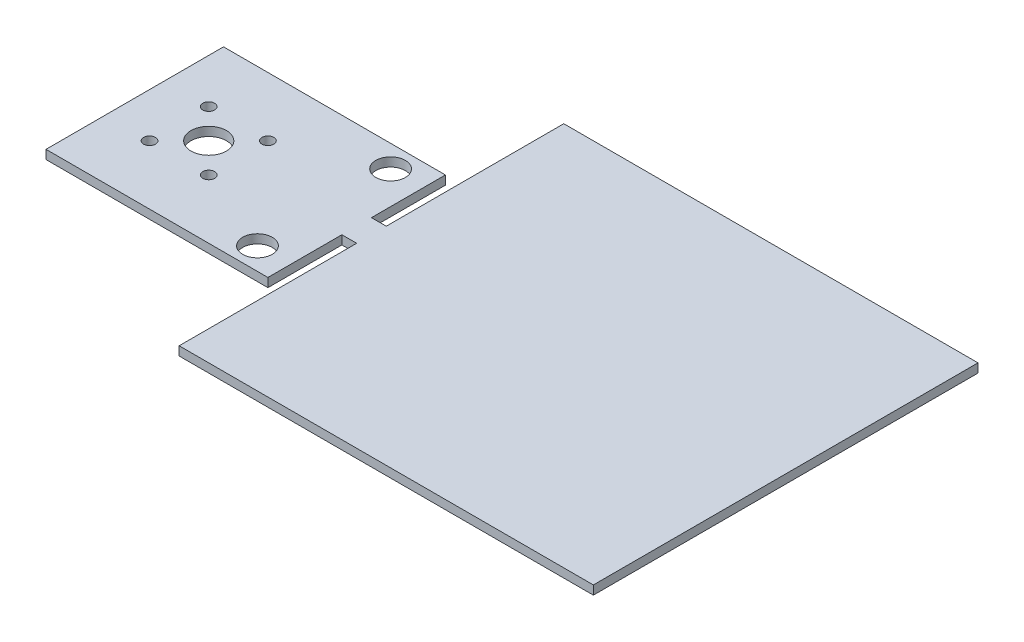
ISO-10303-21;
HEADER;
FILE_DESCRIPTION(('STEP AP214'),'2;1');
FILE_NAME('part.step','',(''),(''),'','','');
FILE_SCHEMA(('AUTOMOTIVE_DESIGN { 1 0 10303 214 1 1 1 1 }'));
ENDSEC;
DATA;
#1=APPLICATION_CONTEXT('core data for automotive mechanical design processes');
#2=APPLICATION_PROTOCOL_DEFINITION('international standard','automotive_design',2000,#1);
#3=PRODUCT_CONTEXT('',#1,'mechanical');
#4=PRODUCT('Part','Part','',(#3));
#5=PRODUCT_RELATED_PRODUCT_CATEGORY('part','',(#4));
#6=PRODUCT_DEFINITION_FORMATION('','',#4);
#7=PRODUCT_DEFINITION_CONTEXT('part definition',#1,'design');
#8=PRODUCT_DEFINITION('design','',#6,#7);
#9=PRODUCT_DEFINITION_SHAPE('','',#8);
#10=(LENGTH_UNIT() NAMED_UNIT(*) SI_UNIT(.MILLI.,.METRE.));
#11=(NAMED_UNIT(*) PLANE_ANGLE_UNIT() SI_UNIT($,.RADIAN.));
#12=(NAMED_UNIT(*) SI_UNIT($,.STERADIAN.) SOLID_ANGLE_UNIT());
#13=UNCERTAINTY_MEASURE_WITH_UNIT(LENGTH_MEASURE(1.E-05),#10,'distance_accuracy_value','');
#14=(GEOMETRIC_REPRESENTATION_CONTEXT(3) GLOBAL_UNCERTAINTY_ASSIGNED_CONTEXT((#13)) GLOBAL_UNIT_ASSIGNED_CONTEXT((#10,
#11,#12)) REPRESENTATION_CONTEXT('',''));
#15=CARTESIAN_POINT('',(0.,0.,0.));
#16=DIRECTION('',(0.,0.,1.));
#17=DIRECTION('',(1.,0.,0.));
#18=AXIS2_PLACEMENT_3D('',#15,#16,#17);
#19=CARTESIAN_POINT('',(0.,1.5,0.));
#20=DIRECTION('',(0.,1.,0.));
#21=DIRECTION('',(0.,0.,1.));
#22=AXIS2_PLACEMENT_3D('',#19,#20,#21);
#23=PLANE('',#22);
#24=CARTESIAN_POINT('',(-86.0288568297003,1.5,22.5));
#25=DIRECTION('',(0.,1.,0.));
#26=DIRECTION('',(0.,0.,1.));
#27=AXIS2_PLACEMENT_3D('',#24,#25,#26);
#28=CIRCLE('',#27,5.);
#29=CARTESIAN_POINT('',(-86.0288568297003,1.5,27.5));
#30=VERTEX_POINT('',#29);
#31=EDGE_CURVE('E284',#30,#30,#28,.T.);
#32=ORIENTED_EDGE('',*,*,#31,.F.);
#33=EDGE_LOOP('',(#32));
#34=FACE_BOUND('',#33,.T.);
#35=CARTESIAN_POINT('',(-86.0288568297003,1.5,-22.5));
#36=DIRECTION('',(0.,1.,0.));
#37=DIRECTION('',(0.,0.,-1.));
#38=AXIS2_PLACEMENT_3D('',#35,#36,#37);
#39=CIRCLE('',#38,5.);
#40=CARTESIAN_POINT('',(-86.0288568297003,1.5,-27.5));
#41=VERTEX_POINT('',#40);
#42=EDGE_CURVE('E278',#41,#41,#39,.T.);
#43=ORIENTED_EDGE('',*,*,#42,.F.);
#44=EDGE_LOOP('',(#43));
#45=FACE_BOUND('',#44,.T.);
#46=DIRECTION('',(1.,0.,0.));
#47=VECTOR('',#46,1.);
#48=CARTESIAN_POINT('',(-70.,1.5,65.));
#49=LINE('',#48,#47);
#50=CARTESIAN_POINT('',(-70.,1.5,65.));
#51=VERTEX_POINT('',#50);
#52=CARTESIAN_POINT('',(70.,1.5,65.));
#53=VERTEX_POINT('',#52);
#54=EDGE_CURVE('E147',#51,#53,#49,.T.);
#55=ORIENTED_EDGE('',*,*,#54,.T.);
#56=DIRECTION('',(0.,0.,-1.));
#57=VECTOR('',#56,1.);
#58=CARTESIAN_POINT('',(70.,1.5,-65.));
#59=LINE('',#58,#57);
#60=CARTESIAN_POINT('',(70.,1.5,-65.));
#61=VERTEX_POINT('',#60);
#62=EDGE_CURVE('E49',#53,#61,#59,.T.);
#63=ORIENTED_EDGE('',*,*,#62,.T.);
#64=DIRECTION('',(-1.,0.,0.));
#65=VECTOR('',#64,1.);
#66=CARTESIAN_POINT('',(-70.,1.5,-65.));
#67=LINE('',#66,#65);
#68=CARTESIAN_POINT('',(-70.,1.5,-65.));
#69=VERTEX_POINT('',#68);
#70=EDGE_CURVE('E244',#61,#69,#67,.T.);
#71=ORIENTED_EDGE('',*,*,#70,.T.);
#72=DIRECTION('',(0.,0.,1.));
#73=VECTOR('',#72,1.);
#74=CARTESIAN_POINT('',(-70.,1.5,-65.));
#75=LINE('',#74,#73);
#76=CARTESIAN_POINT('',(-70.,1.5,-4.99999999999998));
#77=VERTEX_POINT('',#76);
#78=EDGE_CURVE('E202',#69,#77,#75,.T.);
#79=ORIENTED_EDGE('',*,*,#78,.T.);
#80=DIRECTION('',(-1.,0.,0.));
#81=VECTOR('',#80,1.);
#82=CARTESIAN_POINT('',(-75.,1.5,-4.99999999999998));
#83=LINE('',#82,#81);
#84=CARTESIAN_POINT('',(-75.,1.5,-4.99999999999998));
#85=VERTEX_POINT('',#84);
#86=EDGE_CURVE('E224',#77,#85,#83,.T.);
#87=ORIENTED_EDGE('',*,*,#86,.T.);
#88=DIRECTION('',(0.,0.,-1.));
#89=VECTOR('',#88,1.);
#90=CARTESIAN_POINT('',(-75.,1.5,-30.));
#91=LINE('',#90,#89);
#92=CARTESIAN_POINT('',(-75.,1.5,-30.));
#93=VERTEX_POINT('',#92);
#94=EDGE_CURVE('E221',#85,#93,#91,.T.);
#95=ORIENTED_EDGE('',*,*,#94,.T.);
#96=DIRECTION('',(-1.,0.,0.));
#97=VECTOR('',#96,1.);
#98=CARTESIAN_POINT('',(-75.,1.5,-30.));
#99=LINE('',#98,#97);
#100=CARTESIAN_POINT('',(-150.,1.5,-30.));
#101=VERTEX_POINT('',#100);
#102=EDGE_CURVE('E223',#93,#101,#99,.T.);
#103=ORIENTED_EDGE('',*,*,#102,.T.);
#104=DIRECTION('',(0.,0.,1.));
#105=VECTOR('',#104,1.);
#106=CARTESIAN_POINT('',(-150.,1.5,30.));
#107=LINE('',#106,#105);
#108=CARTESIAN_POINT('',(-150.,1.5,30.));
#109=VERTEX_POINT('',#108);
#110=EDGE_CURVE('E226',#101,#109,#107,.T.);
#111=ORIENTED_EDGE('',*,*,#110,.T.);
#112=DIRECTION('',(1.,0.,0.));
#113=VECTOR('',#112,1.);
#114=CARTESIAN_POINT('',(-75.,1.5,30.));
#115=LINE('',#114,#113);
#116=CARTESIAN_POINT('',(-75.,1.5,30.));
#117=VERTEX_POINT('',#116);
#118=EDGE_CURVE('E232',#109,#117,#115,.T.);
#119=ORIENTED_EDGE('',*,*,#118,.T.);
#120=DIRECTION('',(0.,0.,-1.));
#121=VECTOR('',#120,1.);
#122=CARTESIAN_POINT('',(-75.,1.5,30.));
#123=LINE('',#122,#121);
#124=CARTESIAN_POINT('',(-75.,1.5,5.00000000000001));
#125=VERTEX_POINT('',#124);
#126=EDGE_CURVE('E133',#117,#125,#123,.T.);
#127=ORIENTED_EDGE('',*,*,#126,.T.);
#128=DIRECTION('',(1.,0.,0.));
#129=VECTOR('',#128,1.);
#130=CARTESIAN_POINT('',(-75.,1.5,5.00000000000001));
#131=LINE('',#130,#129);
#132=CARTESIAN_POINT('',(-70.,1.5,5.00000000000001));
#133=VERTEX_POINT('',#132);
#134=EDGE_CURVE('E127',#125,#133,#131,.T.);
#135=ORIENTED_EDGE('',*,*,#134,.T.);
#136=DIRECTION('',(0.,0.,1.));
#137=VECTOR('',#136,1.);
#138=CARTESIAN_POINT('',(-70.,1.5,65.));
#139=LINE('',#138,#137);
#140=EDGE_CURVE('E131',#133,#51,#139,.T.);
#141=ORIENTED_EDGE('',*,*,#140,.T.);
#142=EDGE_LOOP('',(#55,#63,#71,#79,#87,#95,#103,#111,#119,#127,#135,#141));
#143=FACE_BOUND('',#142,.T.);
#144=CARTESIAN_POINT('',(-115.,1.5,-9.99999999999999));
#145=DIRECTION('',(0.,1.,0.));
#146=DIRECTION('',(0.,0.,-1.));
#147=AXIS2_PLACEMENT_3D('',#144,#145,#146);
#148=CIRCLE('',#147,2.);
#149=CARTESIAN_POINT('',(-115.,1.5,-12.));
#150=VERTEX_POINT('',#149);
#151=EDGE_CURVE('E269',#150,#150,#148,.T.);
#152=ORIENTED_EDGE('',*,*,#151,.F.);
#153=EDGE_LOOP('',(#152));
#154=FACE_BOUND('',#153,.T.);
#155=CARTESIAN_POINT('',(-135.,1.5,-9.99999999999999));
#156=DIRECTION('',(0.,1.,0.));
#157=DIRECTION('',(0.,0.,1.));
#158=AXIS2_PLACEMENT_3D('',#155,#156,#157);
#159=CIRCLE('',#158,2.);
#160=CARTESIAN_POINT('',(-135.,1.5,-7.99999999999999));
#161=VERTEX_POINT('',#160);
#162=EDGE_CURVE('E257',#161,#161,#159,.T.);
#163=ORIENTED_EDGE('',*,*,#162,.F.);
#164=EDGE_LOOP('',(#163));
#165=FACE_BOUND('',#164,.T.);
#166=CARTESIAN_POINT('',(-115.,1.5,10.));
#167=DIRECTION('',(0.,1.,0.));
#168=DIRECTION('',(0.,0.,1.));
#169=AXIS2_PLACEMENT_3D('',#166,#167,#168);
#170=CIRCLE('',#169,2.);
#171=CARTESIAN_POINT('',(-115.,1.5,12.));
#172=VERTEX_POINT('',#171);
#173=EDGE_CURVE('E156',#172,#172,#170,.T.);
#174=ORIENTED_EDGE('',*,*,#173,.F.);
#175=EDGE_LOOP('',(#174));
#176=FACE_BOUND('',#175,.T.);
#177=CARTESIAN_POINT('',(-135.,1.5,10.));
#178=DIRECTION('',(0.,1.,0.));
#179=DIRECTION('',(0.,0.,-1.));
#180=AXIS2_PLACEMENT_3D('',#177,#178,#179);
#181=CIRCLE('',#180,2.);
#182=CARTESIAN_POINT('',(-135.,1.5,8.00000000000002));
#183=VERTEX_POINT('',#182);
#184=EDGE_CURVE('E251',#183,#183,#181,.T.);
#185=ORIENTED_EDGE('',*,*,#184,.F.);
#186=EDGE_LOOP('',(#185));
#187=FACE_BOUND('',#186,.T.);
#188=CARTESIAN_POINT('',(-125.,1.5,0.));
#189=DIRECTION('',(0.,1.,0.));
#190=DIRECTION('',(0.,0.,-1.));
#191=AXIS2_PLACEMENT_3D('',#188,#189,#190);
#192=CIRCLE('',#191,6.);
#193=CARTESIAN_POINT('',(-125.,1.5,-5.99999999999999));
#194=VERTEX_POINT('',#193);
#195=EDGE_CURVE('E263',#194,#194,#192,.T.);
#196=ORIENTED_EDGE('',*,*,#195,.F.);
#197=EDGE_LOOP('',(#196));
#198=FACE_BOUND('',#197,.T.);
#199=ADVANCED_FACE('F32',(#34,#45,#143,#154,#165,#176,#187,#198),#23,.T.);
#200=CARTESIAN_POINT('',(0.,-1.5,0.));
#201=DIRECTION('',(0.,1.,0.));
#202=DIRECTION('',(0.,0.,1.));
#203=AXIS2_PLACEMENT_3D('',#200,#201,#202);
#204=PLANE('',#203);
#205=CARTESIAN_POINT('',(-86.0288568297003,-1.5,22.5));
#206=DIRECTION('',(0.,1.,0.));
#207=DIRECTION('',(0.,0.,1.));
#208=AXIS2_PLACEMENT_3D('',#205,#206,#207);
#209=CIRCLE('',#208,5.);
#210=CARTESIAN_POINT('',(-86.0288568297003,-1.5,27.5));
#211=VERTEX_POINT('',#210);
#212=EDGE_CURVE('E275',#211,#211,#209,.T.);
#213=ORIENTED_EDGE('',*,*,#212,.T.);
#214=EDGE_LOOP('',(#213));
#215=FACE_BOUND('',#214,.T.);
#216=CARTESIAN_POINT('',(-86.0288568297003,-1.5,-22.5));
#217=DIRECTION('',(0.,1.,0.));
#218=DIRECTION('',(0.,0.,-1.));
#219=AXIS2_PLACEMENT_3D('',#216,#217,#218);
#220=CIRCLE('',#219,5.);
#221=CARTESIAN_POINT('',(-86.0288568297003,-1.5,-27.5));
#222=VERTEX_POINT('',#221);
#223=EDGE_CURVE('E281',#222,#222,#220,.T.);
#224=ORIENTED_EDGE('',*,*,#223,.T.);
#225=EDGE_LOOP('',(#224));
#226=FACE_BOUND('',#225,.T.);
#227=DIRECTION('',(-1.,0.,0.));
#228=VECTOR('',#227,1.);
#229=CARTESIAN_POINT('',(-70.,-1.5,-65.));
#230=LINE('',#229,#228);
#231=CARTESIAN_POINT('',(70.,-1.5,-65.));
#232=VERTEX_POINT('',#231);
#233=CARTESIAN_POINT('',(-70.,-1.5,-65.));
#234=VERTEX_POINT('',#233);
#235=EDGE_CURVE('E153',#232,#234,#230,.T.);
#236=ORIENTED_EDGE('',*,*,#235,.F.);
#237=DIRECTION('',(0.,0.,-1.));
#238=VECTOR('',#237,1.);
#239=CARTESIAN_POINT('',(70.,-1.5,65.));
#240=LINE('',#239,#238);
#241=CARTESIAN_POINT('',(70.,-1.5,65.));
#242=VERTEX_POINT('',#241);
#243=EDGE_CURVE('E173',#242,#232,#240,.T.);
#244=ORIENTED_EDGE('',*,*,#243,.F.);
#245=DIRECTION('',(1.,0.,0.));
#246=VECTOR('',#245,1.);
#247=CARTESIAN_POINT('',(-70.,-1.5,65.));
#248=LINE('',#247,#246);
#249=CARTESIAN_POINT('',(-70.,-1.5,65.));
#250=VERTEX_POINT('',#249);
#251=EDGE_CURVE('E98',#250,#242,#248,.T.);
#252=ORIENTED_EDGE('',*,*,#251,.F.);
#253=DIRECTION('',(0.,0.,1.));
#254=VECTOR('',#253,1.);
#255=CARTESIAN_POINT('',(-70.,-1.5,65.));
#256=LINE('',#255,#254);
#257=CARTESIAN_POINT('',(-70.,-1.5,5.00000000000001));
#258=VERTEX_POINT('',#257);
#259=EDGE_CURVE('E91',#258,#250,#256,.T.);
#260=ORIENTED_EDGE('',*,*,#259,.F.);
#261=DIRECTION('',(1.,0.,0.));
#262=VECTOR('',#261,1.);
#263=CARTESIAN_POINT('',(-75.,-1.5,5.00000000000001));
#264=LINE('',#263,#262);
#265=CARTESIAN_POINT('',(-75.,-1.5,5.00000000000001));
#266=VERTEX_POINT('',#265);
#267=EDGE_CURVE('E141',#266,#258,#264,.T.);
#268=ORIENTED_EDGE('',*,*,#267,.F.);
#269=DIRECTION('',(0.,0.,-1.));
#270=VECTOR('',#269,1.);
#271=CARTESIAN_POINT('',(-75.,-1.5,30.));
#272=LINE('',#271,#270);
#273=CARTESIAN_POINT('',(-75.,-1.5,30.));
#274=VERTEX_POINT('',#273);
#275=EDGE_CURVE('E168',#274,#266,#272,.T.);
#276=ORIENTED_EDGE('',*,*,#275,.F.);
#277=DIRECTION('',(1.,0.,0.));
#278=VECTOR('',#277,1.);
#279=CARTESIAN_POINT('',(-75.,-1.5,30.));
#280=LINE('',#279,#278);
#281=CARTESIAN_POINT('',(-150.,-1.5,30.));
#282=VERTEX_POINT('',#281);
#283=EDGE_CURVE('E166',#282,#274,#280,.T.);
#284=ORIENTED_EDGE('',*,*,#283,.F.);
#285=DIRECTION('',(0.,0.,1.));
#286=VECTOR('',#285,1.);
#287=CARTESIAN_POINT('',(-150.,-1.5,30.));
#288=LINE('',#287,#286);
#289=CARTESIAN_POINT('',(-150.,-1.5,-30.));
#290=VERTEX_POINT('',#289);
#291=EDGE_CURVE('E164',#290,#282,#288,.T.);
#292=ORIENTED_EDGE('',*,*,#291,.F.);
#293=DIRECTION('',(-1.,0.,0.));
#294=VECTOR('',#293,1.);
#295=CARTESIAN_POINT('',(-75.,-1.5,-30.));
#296=LINE('',#295,#294);
#297=CARTESIAN_POINT('',(-75.,-1.5,-30.));
#298=VERTEX_POINT('',#297);
#299=EDGE_CURVE('E162',#298,#290,#296,.T.);
#300=ORIENTED_EDGE('',*,*,#299,.F.);
#301=DIRECTION('',(0.,0.,-1.));
#302=VECTOR('',#301,1.);
#303=CARTESIAN_POINT('',(-75.,-1.5,-30.));
#304=LINE('',#303,#302);
#305=CARTESIAN_POINT('',(-75.,-1.5,-4.99999999999998));
#306=VERTEX_POINT('',#305);
#307=EDGE_CURVE('E160',#306,#298,#304,.T.);
#308=ORIENTED_EDGE('',*,*,#307,.F.);
#309=DIRECTION('',(-1.,0.,0.));
#310=VECTOR('',#309,1.);
#311=CARTESIAN_POINT('',(-75.,-1.5,-4.99999999999998));
#312=LINE('',#311,#310);
#313=CARTESIAN_POINT('',(-70.,-1.5,-4.99999999999998));
#314=VERTEX_POINT('',#313);
#315=EDGE_CURVE('E158',#314,#306,#312,.T.);
#316=ORIENTED_EDGE('',*,*,#315,.F.);
#317=DIRECTION('',(0.,0.,1.));
#318=VECTOR('',#317,1.);
#319=CARTESIAN_POINT('',(-70.,-1.5,-65.));
#320=LINE('',#319,#318);
#321=EDGE_CURVE('E155',#234,#314,#320,.T.);
#322=ORIENTED_EDGE('',*,*,#321,.F.);
#323=EDGE_LOOP('',(#236,#244,#252,#260,#268,#276,#284,#292,#300,#308,#316,#322));
#324=FACE_BOUND('',#323,.T.);
#325=CARTESIAN_POINT('',(-115.,-1.5,10.));
#326=DIRECTION('',(0.,1.,0.));
#327=DIRECTION('',(0.,0.,1.));
#328=AXIS2_PLACEMENT_3D('',#325,#326,#327);
#329=CIRCLE('',#328,2.);
#330=CARTESIAN_POINT('',(-115.,-1.5,12.));
#331=VERTEX_POINT('',#330);
#332=EDGE_CURVE('E248',#331,#331,#329,.T.);
#333=ORIENTED_EDGE('',*,*,#332,.T.);
#334=EDGE_LOOP('',(#333));
#335=FACE_BOUND('',#334,.T.);
#336=CARTESIAN_POINT('',(-135.,-1.5,10.));
#337=DIRECTION('',(0.,1.,0.));
#338=DIRECTION('',(0.,0.,-1.));
#339=AXIS2_PLACEMENT_3D('',#336,#337,#338);
#340=CIRCLE('',#339,2.);
#341=CARTESIAN_POINT('',(-135.,-1.5,8.00000000000002));
#342=VERTEX_POINT('',#341);
#343=EDGE_CURVE('E254',#342,#342,#340,.T.);
#344=ORIENTED_EDGE('',*,*,#343,.T.);
#345=EDGE_LOOP('',(#344));
#346=FACE_BOUND('',#345,.T.);
#347=CARTESIAN_POINT('',(-135.,-1.5,-9.99999999999999));
#348=DIRECTION('',(0.,1.,0.));
#349=DIRECTION('',(0.,0.,1.));
#350=AXIS2_PLACEMENT_3D('',#347,#348,#349);
#351=CIRCLE('',#350,2.);
#352=CARTESIAN_POINT('',(-135.,-1.5,-7.99999999999999));
#353=VERTEX_POINT('',#352);
#354=EDGE_CURVE('E260',#353,#353,#351,.T.);
#355=ORIENTED_EDGE('',*,*,#354,.T.);
#356=EDGE_LOOP('',(#355));
#357=FACE_BOUND('',#356,.T.);
#358=CARTESIAN_POINT('',(-125.,-1.5,0.));
#359=DIRECTION('',(0.,1.,0.));
#360=DIRECTION('',(0.,0.,-1.));
#361=AXIS2_PLACEMENT_3D('',#358,#359,#360);
#362=CIRCLE('',#361,6.);
#363=CARTESIAN_POINT('',(-125.,-1.5,-5.99999999999999));
#364=VERTEX_POINT('',#363);
#365=EDGE_CURVE('E266',#364,#364,#362,.T.);
#366=ORIENTED_EDGE('',*,*,#365,.T.);
#367=EDGE_LOOP('',(#366));
#368=FACE_BOUND('',#367,.T.);
#369=CARTESIAN_POINT('',(-115.,-1.5,-9.99999999999999));
#370=DIRECTION('',(0.,1.,0.));
#371=DIRECTION('',(0.,0.,-1.));
#372=AXIS2_PLACEMENT_3D('',#369,#370,#371);
#373=CIRCLE('',#372,2.);
#374=CARTESIAN_POINT('',(-115.,-1.5,-12.));
#375=VERTEX_POINT('',#374);
#376=EDGE_CURVE('E272',#375,#375,#373,.T.);
#377=ORIENTED_EDGE('',*,*,#376,.T.);
#378=EDGE_LOOP('',(#377));
#379=FACE_BOUND('',#378,.T.);
#380=ADVANCED_FACE('F208',(#215,#226,#324,#335,#346,#357,#368,#379),#204,.F.);
#381=CARTESIAN_POINT('',(-70.,1.5,-65.));
#382=DIRECTION('',(0.,0.,1.));
#383=DIRECTION('',(1.,0.,0.));
#384=AXIS2_PLACEMENT_3D('',#381,#382,#383);
#385=PLANE('',#384);
#386=ORIENTED_EDGE('',*,*,#235,.T.);
#387=DIRECTION('',(0.,-1.,0.));
#388=VECTOR('',#387,1.);
#389=CARTESIAN_POINT('',(-70.,1.5,-65.));
#390=LINE('',#389,#388);
#391=EDGE_CURVE('E41',#69,#234,#390,.T.);
#392=ORIENTED_EDGE('',*,*,#391,.F.);
#393=ORIENTED_EDGE('',*,*,#70,.F.);
#394=DIRECTION('',(0.,-1.,0.));
#395=VECTOR('',#394,1.);
#396=CARTESIAN_POINT('',(70.,1.5,-65.));
#397=LINE('',#396,#395);
#398=EDGE_CURVE('E11',#61,#232,#397,.T.);
#399=ORIENTED_EDGE('',*,*,#398,.T.);
#400=EDGE_LOOP('',(#386,#392,#393,#399));
#401=FACE_BOUND('',#400,.T.);
#402=ADVANCED_FACE('F34',(#401),#385,.F.);
#403=CARTESIAN_POINT('',(-70.,1.5,-65.));
#404=DIRECTION('',(1.,0.,0.));
#405=DIRECTION('',(0.,0.,-1.));
#406=AXIS2_PLACEMENT_3D('',#403,#404,#405);
#407=PLANE('',#406);
#408=ORIENTED_EDGE('',*,*,#321,.T.);
#409=DIRECTION('',(0.,-1.,0.));
#410=VECTOR('',#409,1.);
#411=CARTESIAN_POINT('',(-70.,1.5,-4.99999999999998));
#412=LINE('',#411,#410);
#413=EDGE_CURVE('E193',#77,#314,#412,.T.);
#414=ORIENTED_EDGE('',*,*,#413,.F.);
#415=ORIENTED_EDGE('',*,*,#78,.F.);
#416=ORIENTED_EDGE('',*,*,#391,.T.);
#417=EDGE_LOOP('',(#408,#414,#415,#416));
#418=FACE_BOUND('',#417,.T.);
#419=ADVANCED_FACE('F200',(#418),#407,.F.);
#420=CARTESIAN_POINT('',(-75.,1.5,-4.99999999999998));
#421=DIRECTION('',(0.,0.,1.));
#422=DIRECTION('',(1.,0.,0.));
#423=AXIS2_PLACEMENT_3D('',#420,#421,#422);
#424=PLANE('',#423);
#425=ORIENTED_EDGE('',*,*,#315,.T.);
#426=DIRECTION('',(0.,-1.,0.));
#427=VECTOR('',#426,1.);
#428=CARTESIAN_POINT('',(-75.,1.5,-4.99999999999998));
#429=LINE('',#428,#427);
#430=EDGE_CURVE('E190',#85,#306,#429,.T.);
#431=ORIENTED_EDGE('',*,*,#430,.F.);
#432=ORIENTED_EDGE('',*,*,#86,.F.);
#433=ORIENTED_EDGE('',*,*,#413,.T.);
#434=EDGE_LOOP('',(#425,#431,#432,#433));
#435=FACE_BOUND('',#434,.T.);
#436=ADVANCED_FACE('F215',(#435),#424,.F.);
#437=CARTESIAN_POINT('',(-75.,1.5,-30.));
#438=DIRECTION('',(-1.,0.,0.));
#439=DIRECTION('',(0.,0.,1.));
#440=AXIS2_PLACEMENT_3D('',#437,#438,#439);
#441=PLANE('',#440);
#442=ORIENTED_EDGE('',*,*,#307,.T.);
#443=DIRECTION('',(0.,-1.,0.));
#444=VECTOR('',#443,1.);
#445=CARTESIAN_POINT('',(-75.,1.5,-30.));
#446=LINE('',#445,#444);
#447=EDGE_CURVE('E187',#93,#298,#446,.T.);
#448=ORIENTED_EDGE('',*,*,#447,.F.);
#449=ORIENTED_EDGE('',*,*,#94,.F.);
#450=ORIENTED_EDGE('',*,*,#430,.T.);
#451=EDGE_LOOP('',(#442,#448,#449,#450));
#452=FACE_BOUND('',#451,.T.);
#453=ADVANCED_FACE('F219',(#452),#441,.F.);
#454=CARTESIAN_POINT('',(-75.,1.5,-30.));
#455=DIRECTION('',(0.,0.,1.));
#456=DIRECTION('',(1.,0.,0.));
#457=AXIS2_PLACEMENT_3D('',#454,#455,#456);
#458=PLANE('',#457);
#459=ORIENTED_EDGE('',*,*,#299,.T.);
#460=DIRECTION('',(0.,-1.,0.));
#461=VECTOR('',#460,1.);
#462=CARTESIAN_POINT('',(-150.,1.5,-30.));
#463=LINE('',#462,#461);
#464=EDGE_CURVE('E184',#101,#290,#463,.T.);
#465=ORIENTED_EDGE('',*,*,#464,.F.);
#466=ORIENTED_EDGE('',*,*,#102,.F.);
#467=ORIENTED_EDGE('',*,*,#447,.T.);
#468=EDGE_LOOP('',(#459,#465,#466,#467));
#469=FACE_BOUND('',#468,.T.);
#470=ADVANCED_FACE('F349',(#469),#458,.F.);
#471=CARTESIAN_POINT('',(-150.,1.5,30.));
#472=DIRECTION('',(1.,0.,0.));
#473=DIRECTION('',(0.,0.,-1.));
#474=AXIS2_PLACEMENT_3D('',#471,#472,#473);
#475=PLANE('',#474);
#476=ORIENTED_EDGE('',*,*,#291,.T.);
#477=DIRECTION('',(0.,-1.,0.));
#478=VECTOR('',#477,1.);
#479=CARTESIAN_POINT('',(-150.,1.5,30.));
#480=LINE('',#479,#478);
#481=EDGE_CURVE('E181',#109,#282,#480,.T.);
#482=ORIENTED_EDGE('',*,*,#481,.F.);
#483=ORIENTED_EDGE('',*,*,#110,.F.);
#484=ORIENTED_EDGE('',*,*,#464,.T.);
#485=EDGE_LOOP('',(#476,#482,#483,#484));
#486=FACE_BOUND('',#485,.T.);
#487=ADVANCED_FACE('F346',(#486),#475,.F.);
#488=CARTESIAN_POINT('',(-75.,1.5,30.));
#489=DIRECTION('',(0.,0.,-1.));
#490=DIRECTION('',(-1.,0.,0.));
#491=AXIS2_PLACEMENT_3D('',#488,#489,#490);
#492=PLANE('',#491);
#493=ORIENTED_EDGE('',*,*,#283,.T.);
#494=DIRECTION('',(0.,-1.,0.));
#495=VECTOR('',#494,1.);
#496=CARTESIAN_POINT('',(-75.,1.5,30.));
#497=LINE('',#496,#495);
#498=EDGE_CURVE('E178',#117,#274,#497,.T.);
#499=ORIENTED_EDGE('',*,*,#498,.F.);
#500=ORIENTED_EDGE('',*,*,#118,.F.);
#501=ORIENTED_EDGE('',*,*,#481,.T.);
#502=EDGE_LOOP('',(#493,#499,#500,#501));
#503=FACE_BOUND('',#502,.T.);
#504=ADVANCED_FACE('F238',(#503),#492,.F.);
#505=CARTESIAN_POINT('',(-75.,1.5,30.));
#506=DIRECTION('',(-1.,0.,0.));
#507=DIRECTION('',(0.,0.,1.));
#508=AXIS2_PLACEMENT_3D('',#505,#506,#507);
#509=PLANE('',#508);
#510=ORIENTED_EDGE('',*,*,#275,.T.);
#511=DIRECTION('',(0.,-1.,0.));
#512=VECTOR('',#511,1.);
#513=CARTESIAN_POINT('',(-75.,1.5,5.00000000000001));
#514=LINE('',#513,#512);
#515=EDGE_CURVE('E142',#125,#266,#514,.T.);
#516=ORIENTED_EDGE('',*,*,#515,.F.);
#517=ORIENTED_EDGE('',*,*,#126,.F.);
#518=ORIENTED_EDGE('',*,*,#498,.T.);
#519=EDGE_LOOP('',(#510,#516,#517,#518));
#520=FACE_BOUND('',#519,.T.);
#521=ADVANCED_FACE('F242',(#520),#509,.F.);
#522=CARTESIAN_POINT('',(-75.,1.5,5.00000000000001));
#523=DIRECTION('',(0.,0.,-1.));
#524=DIRECTION('',(-1.,0.,0.));
#525=AXIS2_PLACEMENT_3D('',#522,#523,#524);
#526=PLANE('',#525);
#527=ORIENTED_EDGE('',*,*,#267,.T.);
#528=DIRECTION('',(0.,-1.,0.));
#529=VECTOR('',#528,1.);
#530=CARTESIAN_POINT('',(-70.,1.5,5.00000000000001));
#531=LINE('',#530,#529);
#532=EDGE_CURVE('E138',#133,#258,#531,.T.);
#533=ORIENTED_EDGE('',*,*,#532,.F.);
#534=ORIENTED_EDGE('',*,*,#134,.F.);
#535=ORIENTED_EDGE('',*,*,#515,.T.);
#536=EDGE_LOOP('',(#527,#533,#534,#535));
#537=FACE_BOUND('',#536,.T.);
#538=ADVANCED_FACE('F139',(#537),#526,.F.);
#539=CARTESIAN_POINT('',(-70.,1.5,65.));
#540=DIRECTION('',(1.,0.,0.));
#541=DIRECTION('',(0.,0.,-1.));
#542=AXIS2_PLACEMENT_3D('',#539,#540,#541);
#543=PLANE('',#542);
#544=ORIENTED_EDGE('',*,*,#259,.T.);
#545=DIRECTION('',(0.,-1.,0.));
#546=VECTOR('',#545,1.);
#547=CARTESIAN_POINT('',(-70.,1.5,65.));
#548=LINE('',#547,#546);
#549=EDGE_CURVE('E143',#51,#250,#548,.T.);
#550=ORIENTED_EDGE('',*,*,#549,.F.);
#551=ORIENTED_EDGE('',*,*,#140,.F.);
#552=ORIENTED_EDGE('',*,*,#532,.T.);
#553=EDGE_LOOP('',(#544,#550,#551,#552));
#554=FACE_BOUND('',#553,.T.);
#555=ADVANCED_FACE('F145',(#554),#543,.F.);
#556=CARTESIAN_POINT('',(-70.,1.5,65.));
#557=DIRECTION('',(0.,0.,-1.));
#558=DIRECTION('',(-1.,0.,0.));
#559=AXIS2_PLACEMENT_3D('',#556,#557,#558);
#560=PLANE('',#559);
#561=ORIENTED_EDGE('',*,*,#251,.T.);
#562=DIRECTION('',(0.,-1.,0.));
#563=VECTOR('',#562,1.);
#564=CARTESIAN_POINT('',(70.,1.5,65.));
#565=LINE('',#564,#563);
#566=EDGE_CURVE('E149',#53,#242,#565,.T.);
#567=ORIENTED_EDGE('',*,*,#566,.F.);
#568=ORIENTED_EDGE('',*,*,#54,.F.);
#569=ORIENTED_EDGE('',*,*,#549,.T.);
#570=EDGE_LOOP('',(#561,#567,#568,#569));
#571=FACE_BOUND('',#570,.T.);
#572=ADVANCED_FACE('F335',(#571),#560,.F.);
#573=CARTESIAN_POINT('',(70.,1.5,65.));
#574=DIRECTION('',(-1.,0.,0.));
#575=DIRECTION('',(0.,0.,1.));
#576=AXIS2_PLACEMENT_3D('',#573,#574,#575);
#577=PLANE('',#576);
#578=ORIENTED_EDGE('',*,*,#243,.T.);
#579=ORIENTED_EDGE('',*,*,#398,.F.);
#580=ORIENTED_EDGE('',*,*,#62,.F.);
#581=ORIENTED_EDGE('',*,*,#566,.T.);
#582=EDGE_LOOP('',(#578,#579,#580,#581));
#583=FACE_BOUND('',#582,.T.);
#584=ADVANCED_FACE('F243',(#583),#577,.F.);
#585=CARTESIAN_POINT('',(-115.,1.5,10.));
#586=DIRECTION('',(0.,-1.,0.));
#587=DIRECTION('',(0.,0.,-1.));
#588=AXIS2_PLACEMENT_3D('',#585,#586,#587);
#589=CYLINDRICAL_SURFACE('',#588,2.);
#590=ORIENTED_EDGE('',*,*,#173,.T.);
#591=EDGE_LOOP('',(#590));
#592=FACE_BOUND('',#591,.T.);
#593=ORIENTED_EDGE('',*,*,#332,.F.);
#594=EDGE_LOOP('',(#593));
#595=FACE_BOUND('',#594,.T.);
#596=ADVANCED_FACE('F326',(#592,#595),#589,.F.);
#597=CARTESIAN_POINT('',(-135.,1.5,10.));
#598=DIRECTION('',(0.,-1.,0.));
#599=DIRECTION('',(0.,0.,-1.));
#600=AXIS2_PLACEMENT_3D('',#597,#598,#599);
#601=CYLINDRICAL_SURFACE('',#600,2.);
#602=ORIENTED_EDGE('',*,*,#184,.T.);
#603=EDGE_LOOP('',(#602));
#604=FACE_BOUND('',#603,.T.);
#605=ORIENTED_EDGE('',*,*,#343,.F.);
#606=EDGE_LOOP('',(#605));
#607=FACE_BOUND('',#606,.T.);
#608=ADVANCED_FACE('F322',(#604,#607),#601,.F.);
#609=CARTESIAN_POINT('',(-135.,1.5,-9.99999999999999));
#610=DIRECTION('',(0.,-1.,0.));
#611=DIRECTION('',(0.,0.,-1.));
#612=AXIS2_PLACEMENT_3D('',#609,#610,#611);
#613=CYLINDRICAL_SURFACE('',#612,2.);
#614=ORIENTED_EDGE('',*,*,#162,.T.);
#615=EDGE_LOOP('',(#614));
#616=FACE_BOUND('',#615,.T.);
#617=ORIENTED_EDGE('',*,*,#354,.F.);
#618=EDGE_LOOP('',(#617));
#619=FACE_BOUND('',#618,.T.);
#620=ADVANCED_FACE('F318',(#616,#619),#613,.F.);
#621=CARTESIAN_POINT('',(-125.,1.5,0.));
#622=DIRECTION('',(0.,-1.,0.));
#623=DIRECTION('',(0.,0.,-1.));
#624=AXIS2_PLACEMENT_3D('',#621,#622,#623);
#625=CYLINDRICAL_SURFACE('',#624,6.);
#626=ORIENTED_EDGE('',*,*,#195,.T.);
#627=EDGE_LOOP('',(#626));
#628=FACE_BOUND('',#627,.T.);
#629=ORIENTED_EDGE('',*,*,#365,.F.);
#630=EDGE_LOOP('',(#629));
#631=FACE_BOUND('',#630,.T.);
#632=ADVANCED_FACE('F311',(#628,#631),#625,.F.);
#633=CARTESIAN_POINT('',(-115.,1.5,-9.99999999999999));
#634=DIRECTION('',(0.,-1.,0.));
#635=DIRECTION('',(0.,0.,-1.));
#636=AXIS2_PLACEMENT_3D('',#633,#634,#635);
#637=CYLINDRICAL_SURFACE('',#636,2.);
#638=ORIENTED_EDGE('',*,*,#151,.T.);
#639=EDGE_LOOP('',(#638));
#640=FACE_BOUND('',#639,.T.);
#641=ORIENTED_EDGE('',*,*,#376,.F.);
#642=EDGE_LOOP('',(#641));
#643=FACE_BOUND('',#642,.T.);
#644=ADVANCED_FACE('F305',(#640,#643),#637,.F.);
#645=CARTESIAN_POINT('',(-86.0288568297003,-1.5,-22.5));
#646=DIRECTION('',(0.,1.,0.));
#647=DIRECTION('',(0.,0.,1.));
#648=AXIS2_PLACEMENT_3D('',#645,#646,#647);
#649=CYLINDRICAL_SURFACE('',#648,5.);
#650=ORIENTED_EDGE('',*,*,#223,.F.);
#651=EDGE_LOOP('',(#650));
#652=FACE_BOUND('',#651,.T.);
#653=ORIENTED_EDGE('',*,*,#42,.T.);
#654=EDGE_LOOP('',(#653));
#655=FACE_BOUND('',#654,.T.);
#656=ADVANCED_FACE('F295',(#652,#655),#649,.F.);
#657=CARTESIAN_POINT('',(-86.0288568297003,-1.5,22.5));
#658=DIRECTION('',(0.,1.,0.));
#659=DIRECTION('',(0.,0.,1.));
#660=AXIS2_PLACEMENT_3D('',#657,#658,#659);
#661=CYLINDRICAL_SURFACE('',#660,5.);
#662=ORIENTED_EDGE('',*,*,#212,.F.);
#663=EDGE_LOOP('',(#662));
#664=FACE_BOUND('',#663,.T.);
#665=ORIENTED_EDGE('',*,*,#31,.T.);
#666=EDGE_LOOP('',(#665));
#667=FACE_BOUND('',#666,.T.);
#668=ADVANCED_FACE('F292',(#664,#667),#661,.F.);
#669=CLOSED_SHELL('',(#199,#380,#402,#419,#436,#453,#470,#487,#504,#521,#538,#555,#572,#584,
#596,#608,#620,#632,#644,#656,#668));
#670=MANIFOLD_SOLID_BREP('B2',#669);
#671=ADVANCED_BREP_SHAPE_REPRESENTATION('',(#18,#670),#14);
#672=SHAPE_DEFINITION_REPRESENTATION(#9,#671);
ENDSEC;
END-ISO-10303-21;
